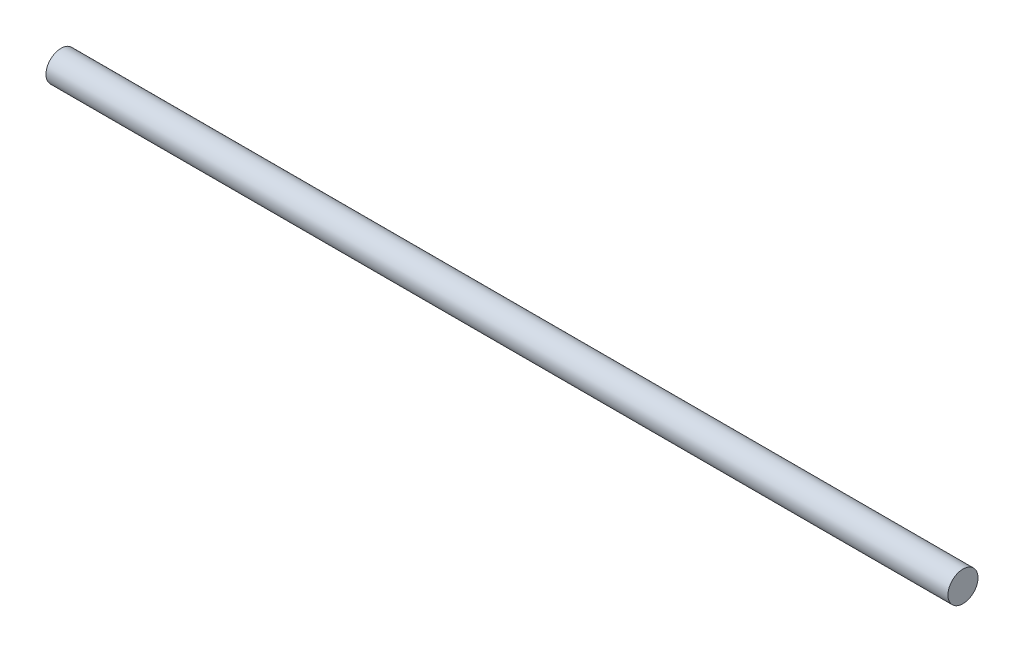
ISO-10303-21;
HEADER;
FILE_DESCRIPTION(('STEP AP214'),'2;1');
FILE_NAME('part.step','',(''),(''),'','','');
FILE_SCHEMA(('AUTOMOTIVE_DESIGN { 1 0 10303 214 1 1 1 1 }'));
ENDSEC;
DATA;
#1=APPLICATION_CONTEXT('core data for automotive mechanical design processes');
#2=APPLICATION_PROTOCOL_DEFINITION('international standard','automotive_design',2000,#1);
#3=PRODUCT_CONTEXT('',#1,'mechanical');
#4=PRODUCT('Part','Part','',(#3));
#5=PRODUCT_RELATED_PRODUCT_CATEGORY('part','',(#4));
#6=PRODUCT_DEFINITION_FORMATION('','',#4);
#7=PRODUCT_DEFINITION_CONTEXT('part definition',#1,'design');
#8=PRODUCT_DEFINITION('design','',#6,#7);
#9=PRODUCT_DEFINITION_SHAPE('','',#8);
#10=(LENGTH_UNIT() NAMED_UNIT(*) SI_UNIT(.MILLI.,.METRE.));
#11=(NAMED_UNIT(*) PLANE_ANGLE_UNIT() SI_UNIT($,.RADIAN.));
#12=(NAMED_UNIT(*) SI_UNIT($,.STERADIAN.) SOLID_ANGLE_UNIT());
#13=UNCERTAINTY_MEASURE_WITH_UNIT(LENGTH_MEASURE(1.E-05),#10,'distance_accuracy_value','');
#14=(GEOMETRIC_REPRESENTATION_CONTEXT(3) GLOBAL_UNCERTAINTY_ASSIGNED_CONTEXT((#13)) GLOBAL_UNIT_ASSIGNED_CONTEXT((#10,
#11,#12)) REPRESENTATION_CONTEXT('',''));
#15=CARTESIAN_POINT('',(0.,0.,0.));
#16=DIRECTION('',(0.,0.,1.));
#17=DIRECTION('',(1.,0.,0.));
#18=AXIS2_PLACEMENT_3D('',#15,#16,#17);
#19=CARTESIAN_POINT('',(60.,0.,0.));
#20=DIRECTION('',(-1.,0.,0.));
#21=DIRECTION('',(0.,0.,1.));
#22=AXIS2_PLACEMENT_3D('',#19,#20,#21);
#23=CYLINDRICAL_SURFACE('',#22,1.);
#24=CARTESIAN_POINT('',(60.,0.,0.));
#25=DIRECTION('',(1.,0.,0.));
#26=DIRECTION('',(0.,0.,-1.));
#27=AXIS2_PLACEMENT_3D('',#24,#25,#26);
#28=CIRCLE('',#27,1.);
#29=CARTESIAN_POINT('',(60.,0.,-1.));
#30=VERTEX_POINT('',#29);
#31=EDGE_CURVE('E10',#30,#30,#28,.T.);
#32=ORIENTED_EDGE('',*,*,#31,.F.);
#33=EDGE_LOOP('',(#32));
#34=FACE_BOUND('',#33,.T.);
#35=CARTESIAN_POINT('',(0.,0.,0.));
#36=DIRECTION('',(1.,0.,0.));
#37=DIRECTION('',(0.,0.,-1.));
#38=AXIS2_PLACEMENT_3D('',#35,#36,#37);
#39=CIRCLE('',#38,1.);
#40=CARTESIAN_POINT('',(0.,0.,-1.));
#41=VERTEX_POINT('',#40);
#42=EDGE_CURVE('E40',#41,#41,#39,.T.);
#43=ORIENTED_EDGE('',*,*,#42,.T.);
#44=EDGE_LOOP('',(#43));
#45=FACE_BOUND('',#44,.T.);
#46=ADVANCED_FACE('F37',(#34,#45),#23,.T.);
#47=CARTESIAN_POINT('',(60.,0.,0.));
#48=DIRECTION('',(1.,0.,0.));
#49=DIRECTION('',(0.,0.,-1.));
#50=AXIS2_PLACEMENT_3D('',#47,#48,#49);
#51=PLANE('',#50);
#52=ORIENTED_EDGE('',*,*,#31,.T.);
#53=EDGE_LOOP('',(#52));
#54=FACE_BOUND('',#53,.T.);
#55=ADVANCED_FACE('F52',(#54),#51,.T.);
#56=CARTESIAN_POINT('',(0.,0.,0.));
#57=DIRECTION('',(1.,0.,0.));
#58=DIRECTION('',(0.,0.,-1.));
#59=AXIS2_PLACEMENT_3D('',#56,#57,#58);
#60=PLANE('',#59);
#61=ORIENTED_EDGE('',*,*,#42,.F.);
#62=EDGE_LOOP('',(#61));
#63=FACE_BOUND('',#62,.T.);
#64=ADVANCED_FACE('F50',(#63),#60,.F.);
#65=CLOSED_SHELL('',(#46,#55,#64));
#66=MANIFOLD_SOLID_BREP('B2',#65);
#67=ADVANCED_BREP_SHAPE_REPRESENTATION('',(#18,#66),#14);
#68=SHAPE_DEFINITION_REPRESENTATION(#9,#67);
ENDSEC;
END-ISO-10303-21;
